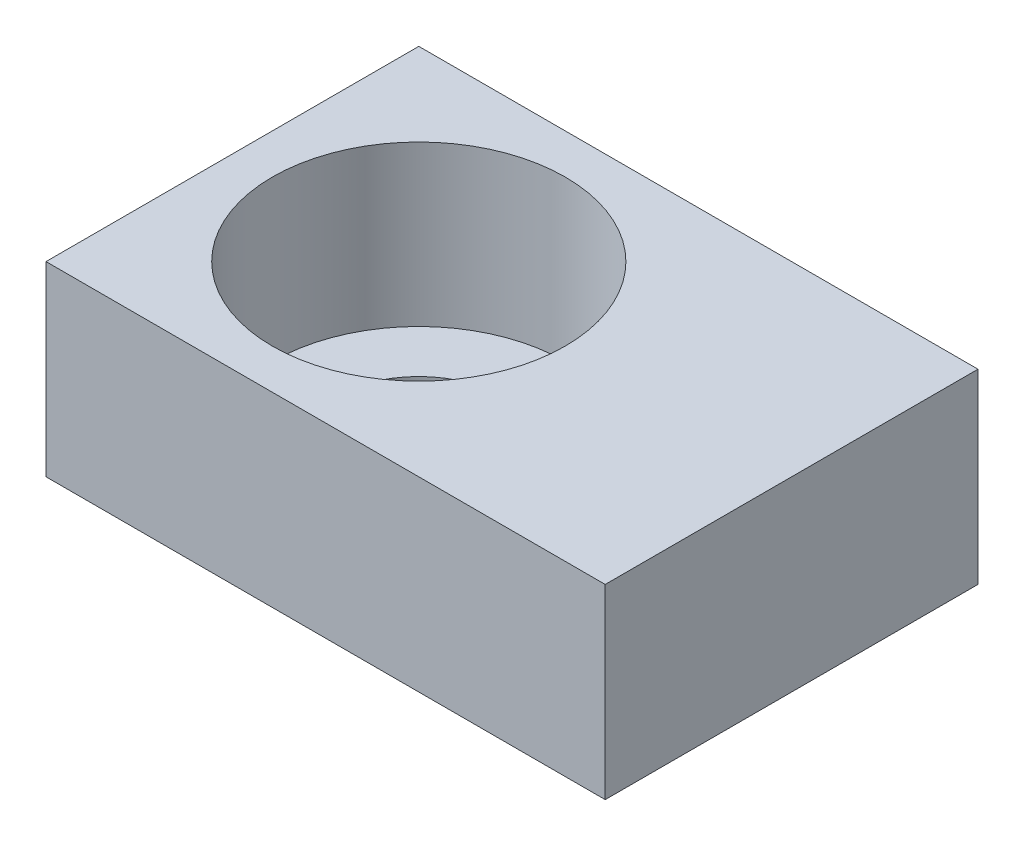
ISO-10303-21;
HEADER;
FILE_DESCRIPTION(('STEP AP214'),'2;1');
FILE_NAME('part.step','',(''),(''),'','','');
FILE_SCHEMA(('AUTOMOTIVE_DESIGN { 1 0 10303 214 1 1 1 1 }'));
ENDSEC;
DATA;
#1=APPLICATION_CONTEXT('core data for automotive mechanical design processes');
#2=APPLICATION_PROTOCOL_DEFINITION('international standard','automotive_design',2000,#1);
#3=PRODUCT_CONTEXT('',#1,'mechanical');
#4=PRODUCT('Part','Part','',(#3));
#5=PRODUCT_RELATED_PRODUCT_CATEGORY('part','',(#4));
#6=PRODUCT_DEFINITION_FORMATION('','',#4);
#7=PRODUCT_DEFINITION_CONTEXT('part definition',#1,'design');
#8=PRODUCT_DEFINITION('design','',#6,#7);
#9=PRODUCT_DEFINITION_SHAPE('','',#8);
#10=(LENGTH_UNIT() NAMED_UNIT(*) SI_UNIT(.MILLI.,.METRE.));
#11=(NAMED_UNIT(*) PLANE_ANGLE_UNIT() SI_UNIT($,.RADIAN.));
#12=(NAMED_UNIT(*) SI_UNIT($,.STERADIAN.) SOLID_ANGLE_UNIT());
#13=UNCERTAINTY_MEASURE_WITH_UNIT(LENGTH_MEASURE(1.E-05),#10,'distance_accuracy_value','');
#14=(GEOMETRIC_REPRESENTATION_CONTEXT(3) GLOBAL_UNCERTAINTY_ASSIGNED_CONTEXT((#13)) GLOBAL_UNIT_ASSIGNED_CONTEXT((#10,
#11,#12)) REPRESENTATION_CONTEXT('',''));
#15=CARTESIAN_POINT('',(0.,0.,0.));
#16=DIRECTION('',(0.,0.,1.));
#17=DIRECTION('',(1.,0.,0.));
#18=AXIS2_PLACEMENT_3D('',#15,#16,#17);
#19=CARTESIAN_POINT('',(3.5,6.,3.5));
#20=DIRECTION('',(0.,-1.,0.));
#21=DIRECTION('',(0.,0.,-1.));
#22=AXIS2_PLACEMENT_3D('',#19,#20,#21);
#23=CYLINDRICAL_SURFACE('',#22,1.6);
#24=CARTESIAN_POINT('',(3.5,0.,3.5));
#25=DIRECTION('',(0.,-1.,0.));
#26=DIRECTION('',(0.,0.,-1.));
#27=AXIS2_PLACEMENT_3D('',#24,#25,#26);
#28=CIRCLE('',#27,1.6);
#29=CARTESIAN_POINT('',(3.5,0.,1.9));
#30=VERTEX_POINT('',#29);
#31=EDGE_CURVE('E101',#30,#30,#28,.T.);
#32=ORIENTED_EDGE('',*,*,#31,.T.);
#33=EDGE_LOOP('',(#32));
#34=FACE_BOUND('',#33,.T.);
#35=CARTESIAN_POINT('',(3.5,0.499999999999999,3.5));
#36=DIRECTION('',(0.,1.,0.));
#37=DIRECTION('',(-1.,0.,0.));
#38=AXIS2_PLACEMENT_3D('',#35,#36,#37);
#39=CIRCLE('',#38,1.6);
#40=CARTESIAN_POINT('',(1.9,0.499999999999998,3.5));
#41=VERTEX_POINT('',#40);
#42=EDGE_CURVE('E36',#41,#41,#39,.F.);
#43=ORIENTED_EDGE('',*,*,#42,.F.);
#44=EDGE_LOOP('',(#43));
#45=FACE_BOUND('',#44,.T.);
#46=ADVANCED_FACE('F32',(#34,#45),#23,.F.);
#47=CARTESIAN_POINT('',(0.,3.5,7.));
#48=DIRECTION('',(1.,0.,0.));
#49=DIRECTION('',(0.,1.,0.));
#50=AXIS2_PLACEMENT_3D('',#47,#48,#49);
#51=PLANE('',#50);
#52=DIRECTION('',(0.,-1.,0.));
#53=VECTOR('',#52,1.);
#54=CARTESIAN_POINT('',(0.,3.5,0.));
#55=LINE('',#54,#53);
#56=CARTESIAN_POINT('',(0.,3.5,0.));
#57=VERTEX_POINT('',#56);
#58=CARTESIAN_POINT('',(0.,0.,0.));
#59=VERTEX_POINT('',#58);
#60=EDGE_CURVE('E98',#57,#59,#55,.T.);
#61=ORIENTED_EDGE('',*,*,#60,.T.);
#62=DIRECTION('',(0.,0.,-1.));
#63=VECTOR('',#62,1.);
#64=CARTESIAN_POINT('',(0.,0.,7.));
#65=LINE('',#64,#63);
#66=CARTESIAN_POINT('',(0.,0.,7.));
#67=VERTEX_POINT('',#66);
#68=EDGE_CURVE('E11',#67,#59,#65,.T.);
#69=ORIENTED_EDGE('',*,*,#68,.F.);
#70=DIRECTION('',(0.,-1.,0.));
#71=VECTOR('',#70,1.);
#72=CARTESIAN_POINT('',(0.,3.5,7.));
#73=LINE('',#72,#71);
#74=CARTESIAN_POINT('',(0.,3.5,7.));
#75=VERTEX_POINT('',#74);
#76=EDGE_CURVE('E85',#75,#67,#73,.T.);
#77=ORIENTED_EDGE('',*,*,#76,.F.);
#78=DIRECTION('',(0.,0.,-1.));
#79=VECTOR('',#78,1.);
#80=CARTESIAN_POINT('',(0.,3.5,7.));
#81=LINE('',#80,#79);
#82=EDGE_CURVE('E94',#75,#57,#81,.T.);
#83=ORIENTED_EDGE('',*,*,#82,.T.);
#84=EDGE_LOOP('',(#61,#69,#77,#83));
#85=FACE_BOUND('',#84,.T.);
#86=ADVANCED_FACE('F34',(#85),#51,.F.);
#87=CARTESIAN_POINT('',(7.,0.,7.));
#88=DIRECTION('',(0.,1.,0.));
#89=DIRECTION('',(0.,0.,1.));
#90=AXIS2_PLACEMENT_3D('',#87,#88,#89);
#91=PLANE('',#90);
#92=ORIENTED_EDGE('',*,*,#31,.F.);
#93=EDGE_LOOP('',(#92));
#94=FACE_BOUND('',#93,.T.);
#95=DIRECTION('',(1.,0.,0.));
#96=VECTOR('',#95,1.);
#97=CARTESIAN_POINT('',(7.,0.,0.));
#98=LINE('',#97,#96);
#99=CARTESIAN_POINT('',(10.5,0.,0.));
#100=VERTEX_POINT('',#99);
#101=EDGE_CURVE('E89',#59,#100,#98,.T.);
#102=ORIENTED_EDGE('',*,*,#101,.T.);
#103=DIRECTION('',(0.,0.,-1.));
#104=VECTOR('',#103,1.);
#105=CARTESIAN_POINT('',(10.5,0.,7.));
#106=LINE('',#105,#104);
#107=CARTESIAN_POINT('',(10.5,0.,7.));
#108=VERTEX_POINT('',#107);
#109=EDGE_CURVE('E42',#108,#100,#106,.T.);
#110=ORIENTED_EDGE('',*,*,#109,.F.);
#111=DIRECTION('',(1.,0.,0.));
#112=VECTOR('',#111,1.);
#113=CARTESIAN_POINT('',(0.,0.,7.));
#114=LINE('',#113,#112);
#115=EDGE_CURVE('E80',#67,#108,#114,.T.);
#116=ORIENTED_EDGE('',*,*,#115,.F.);
#117=ORIENTED_EDGE('',*,*,#68,.T.);
#118=EDGE_LOOP('',(#102,#110,#116,#117));
#119=FACE_BOUND('',#118,.T.);
#120=ADVANCED_FACE('F88',(#94,#119),#91,.F.);
#121=CARTESIAN_POINT('',(10.5,0.,7.));
#122=DIRECTION('',(-1.,0.,0.));
#123=DIRECTION('',(0.,0.,1.));
#124=AXIS2_PLACEMENT_3D('',#121,#122,#123);
#125=PLANE('',#124);
#126=DIRECTION('',(0.,1.,0.));
#127=VECTOR('',#126,1.);
#128=CARTESIAN_POINT('',(10.5,0.,0.));
#129=LINE('',#128,#127);
#130=CARTESIAN_POINT('',(10.5,3.5,0.));
#131=VERTEX_POINT('',#130);
#132=EDGE_CURVE('E67',#100,#131,#129,.T.);
#133=ORIENTED_EDGE('',*,*,#132,.T.);
#134=DIRECTION('',(0.,0.,-1.));
#135=VECTOR('',#134,1.);
#136=CARTESIAN_POINT('',(10.5,3.5,7.));
#137=LINE('',#136,#135);
#138=CARTESIAN_POINT('',(10.5,3.5,7.));
#139=VERTEX_POINT('',#138);
#140=EDGE_CURVE('E90',#139,#131,#137,.T.);
#141=ORIENTED_EDGE('',*,*,#140,.F.);
#142=DIRECTION('',(0.,1.,0.));
#143=VECTOR('',#142,1.);
#144=CARTESIAN_POINT('',(10.5,0.,7.));
#145=LINE('',#144,#143);
#146=EDGE_CURVE('E83',#108,#139,#145,.T.);
#147=ORIENTED_EDGE('',*,*,#146,.F.);
#148=ORIENTED_EDGE('',*,*,#109,.T.);
#149=EDGE_LOOP('',(#133,#141,#147,#148));
#150=FACE_BOUND('',#149,.T.);
#151=ADVANCED_FACE('F92',(#150),#125,.F.);
#152=CARTESIAN_POINT('',(10.5,3.5,7.));
#153=DIRECTION('',(0.,-1.,0.));
#154=DIRECTION('',(1.,0.,0.));
#155=AXIS2_PLACEMENT_3D('',#152,#153,#154);
#156=PLANE('',#155);
#157=CARTESIAN_POINT('',(3.5,3.5,3.5));
#158=DIRECTION('',(0.,1.,0.));
#159=DIRECTION('',(-1.,0.,0.));
#160=AXIS2_PLACEMENT_3D('',#157,#158,#159);
#161=CIRCLE('',#160,2.75);
#162=CARTESIAN_POINT('',(0.750000000000001,3.5,3.5));
#163=VERTEX_POINT('',#162);
#164=EDGE_CURVE('E114',#163,#163,#161,.T.);
#165=ORIENTED_EDGE('',*,*,#164,.F.);
#166=EDGE_LOOP('',(#165));
#167=FACE_BOUND('',#166,.T.);
#168=DIRECTION('',(-1.,0.,0.));
#169=VECTOR('',#168,1.);
#170=CARTESIAN_POINT('',(10.5,3.5,0.));
#171=LINE('',#170,#169);
#172=EDGE_CURVE('E73',#131,#57,#171,.T.);
#173=ORIENTED_EDGE('',*,*,#172,.T.);
#174=ORIENTED_EDGE('',*,*,#82,.F.);
#175=DIRECTION('',(-1.,0.,0.));
#176=VECTOR('',#175,1.);
#177=CARTESIAN_POINT('',(10.5,3.5,7.));
#178=LINE('',#177,#176);
#179=EDGE_CURVE('E50',#139,#75,#178,.T.);
#180=ORIENTED_EDGE('',*,*,#179,.F.);
#181=ORIENTED_EDGE('',*,*,#140,.T.);
#182=EDGE_LOOP('',(#173,#174,#180,#181));
#183=FACE_BOUND('',#182,.T.);
#184=ADVANCED_FACE('F106',(#167,#183),#156,.F.);
#185=CARTESIAN_POINT('',(0.,0.,7.));
#186=DIRECTION('',(0.,0.,1.));
#187=DIRECTION('',(1.,0.,0.));
#188=AXIS2_PLACEMENT_3D('',#185,#186,#187);
#189=PLANE('',#188);
#190=ORIENTED_EDGE('',*,*,#76,.T.);
#191=ORIENTED_EDGE('',*,*,#115,.T.);
#192=ORIENTED_EDGE('',*,*,#146,.T.);
#193=ORIENTED_EDGE('',*,*,#179,.T.);
#194=EDGE_LOOP('',(#190,#191,#192,#193));
#195=FACE_BOUND('',#194,.T.);
#196=ADVANCED_FACE('F81',(#195),#189,.T.);
#197=CARTESIAN_POINT('',(0.,0.,0.));
#198=DIRECTION('',(0.,0.,1.));
#199=DIRECTION('',(1.,0.,0.));
#200=AXIS2_PLACEMENT_3D('',#197,#198,#199);
#201=PLANE('',#200);
#202=ORIENTED_EDGE('',*,*,#60,.F.);
#203=ORIENTED_EDGE('',*,*,#172,.F.);
#204=ORIENTED_EDGE('',*,*,#132,.F.);
#205=ORIENTED_EDGE('',*,*,#101,.F.);
#206=EDGE_LOOP('',(#202,#203,#204,#205));
#207=FACE_BOUND('',#206,.T.);
#208=ADVANCED_FACE('F109',(#207),#201,.F.);
#209=CARTESIAN_POINT('',(3.5,0.499999999999999,3.5));
#210=DIRECTION('',(0.,1.,0.));
#211=DIRECTION('',(-1.,0.,0.));
#212=AXIS2_PLACEMENT_3D('',#209,#210,#211);
#213=PLANE('',#212);
#214=CARTESIAN_POINT('',(3.5,0.499999999999999,3.5));
#215=DIRECTION('',(0.,1.,0.));
#216=DIRECTION('',(-1.,0.,0.));
#217=AXIS2_PLACEMENT_3D('',#214,#215,#216);
#218=CIRCLE('',#217,2.75);
#219=CARTESIAN_POINT('',(0.750000000000001,0.499999999999998,3.5));
#220=VERTEX_POINT('',#219);
#221=EDGE_CURVE('E117',#220,#220,#218,.T.);
#222=ORIENTED_EDGE('',*,*,#221,.T.);
#223=EDGE_LOOP('',(#222));
#224=FACE_BOUND('',#223,.T.);
#225=ORIENTED_EDGE('',*,*,#42,.T.);
#226=EDGE_LOOP('',(#225));
#227=FACE_BOUND('',#226,.T.);
#228=ADVANCED_FACE('F124',(#224,#227),#213,.T.);
#229=CARTESIAN_POINT('',(3.5,0.499999999999999,3.5));
#230=DIRECTION('',(0.,1.,0.));
#231=DIRECTION('',(-1.,0.,0.));
#232=AXIS2_PLACEMENT_3D('',#229,#230,#231);
#233=CYLINDRICAL_SURFACE('',#232,2.75);
#234=ORIENTED_EDGE('',*,*,#221,.F.);
#235=EDGE_LOOP('',(#234));
#236=FACE_BOUND('',#235,.T.);
#237=ORIENTED_EDGE('',*,*,#164,.T.);
#238=EDGE_LOOP('',(#237));
#239=FACE_BOUND('',#238,.T.);
#240=ADVANCED_FACE('F134',(#236,#239),#233,.F.);
#241=CLOSED_SHELL('',(#46,#86,#120,#151,#184,#196,#208,#228,#240));
#242=MANIFOLD_SOLID_BREP('B2',#241);
#243=ADVANCED_BREP_SHAPE_REPRESENTATION('',(#18,#242),#14);
#244=SHAPE_DEFINITION_REPRESENTATION(#9,#243);
ENDSEC;
END-ISO-10303-21;
